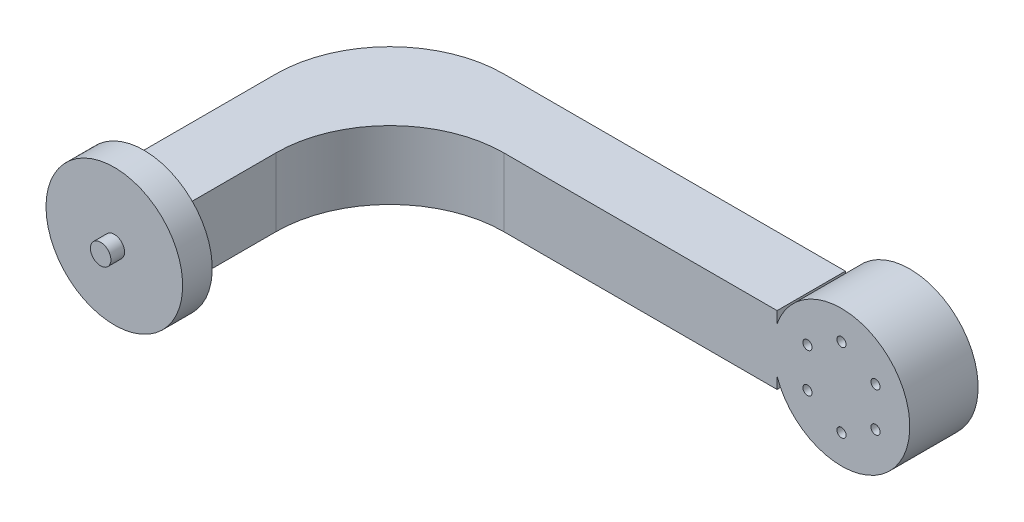
ISO-10303-21;
HEADER;
FILE_DESCRIPTION(('STEP AP214'),'2;1');
FILE_NAME('part.step','',(''),(''),'','','');
FILE_SCHEMA(('AUTOMOTIVE_DESIGN { 1 0 10303 214 1 1 1 1 }'));
ENDSEC;
DATA;
#1=APPLICATION_CONTEXT('core data for automotive mechanical design processes');
#2=APPLICATION_PROTOCOL_DEFINITION('international standard','automotive_design',2000,#1);
#3=PRODUCT_CONTEXT('',#1,'mechanical');
#4=PRODUCT('Part','Part','',(#3));
#5=PRODUCT_RELATED_PRODUCT_CATEGORY('part','',(#4));
#6=PRODUCT_DEFINITION_FORMATION('','',#4);
#7=PRODUCT_DEFINITION_CONTEXT('part definition',#1,'design');
#8=PRODUCT_DEFINITION('design','',#6,#7);
#9=PRODUCT_DEFINITION_SHAPE('','',#8);
#10=(LENGTH_UNIT() NAMED_UNIT(*) SI_UNIT(.MILLI.,.METRE.));
#11=(NAMED_UNIT(*) PLANE_ANGLE_UNIT() SI_UNIT($,.RADIAN.));
#12=(NAMED_UNIT(*) SI_UNIT($,.STERADIAN.) SOLID_ANGLE_UNIT());
#13=UNCERTAINTY_MEASURE_WITH_UNIT(LENGTH_MEASURE(1.E-05),#10,'distance_accuracy_value','');
#14=(GEOMETRIC_REPRESENTATION_CONTEXT(3) GLOBAL_UNCERTAINTY_ASSIGNED_CONTEXT((#13)) GLOBAL_UNIT_ASSIGNED_CONTEXT((#10,
#11,#12)) REPRESENTATION_CONTEXT('',''));
#15=CARTESIAN_POINT('',(0.,0.,0.));
#16=DIRECTION('',(0.,0.,1.));
#17=DIRECTION('',(1.,0.,0.));
#18=AXIS2_PLACEMENT_3D('',#15,#16,#17);
#19=CARTESIAN_POINT('',(-50.,0.,50.));
#20=DIRECTION('',(0.,-1.,0.));
#21=DIRECTION('',(0.,0.,-1.));
#22=AXIS2_PLACEMENT_3D('',#19,#20,#21);
#23=CYLINDRICAL_SURFACE('',#22,50.);
#24=DIRECTION('',(0.,-1.,0.));
#25=VECTOR('',#24,1.);
#26=CARTESIAN_POINT('',(-100.,0.,50.));
#27=LINE('',#26,#25);
#28=CARTESIAN_POINT('',(-100.,15.,50.));
#29=VERTEX_POINT('',#28);
#30=CARTESIAN_POINT('',(-100.,-15.,50.));
#31=VERTEX_POINT('',#30);
#32=EDGE_CURVE('E227',#29,#31,#27,.T.);
#33=ORIENTED_EDGE('',*,*,#32,.F.);
#34=CARTESIAN_POINT('',(-50.,15.,50.));
#35=DIRECTION('',(0.,1.,0.));
#36=DIRECTION('',(0.,0.,1.));
#37=AXIS2_PLACEMENT_3D('',#34,#35,#36);
#38=CIRCLE('',#37,50.);
#39=CARTESIAN_POINT('',(-50.,15.,0.));
#40=VERTEX_POINT('',#39);
#41=EDGE_CURVE('E61',#40,#29,#38,.T.);
#42=ORIENTED_EDGE('',*,*,#41,.F.);
#43=DIRECTION('',(0.,-1.,0.));
#44=VECTOR('',#43,1.);
#45=CARTESIAN_POINT('',(-50.,0.,0.));
#46=LINE('',#45,#44);
#47=CARTESIAN_POINT('',(-50.,-15.,0.));
#48=VERTEX_POINT('',#47);
#49=EDGE_CURVE('E230',#48,#40,#46,.F.);
#50=ORIENTED_EDGE('',*,*,#49,.F.);
#51=CARTESIAN_POINT('',(-50.,-15.,50.));
#52=DIRECTION('',(0.,1.,0.));
#53=DIRECTION('',(0.,0.,1.));
#54=AXIS2_PLACEMENT_3D('',#51,#52,#53);
#55=CIRCLE('',#54,50.);
#56=EDGE_CURVE('E48',#31,#48,#55,.F.);
#57=ORIENTED_EDGE('',*,*,#56,.F.);
#58=EDGE_LOOP('',(#33,#42,#50,#57));
#59=FACE_BOUND('',#58,.T.);
#60=ADVANCED_FACE('F45',(#59),#23,.T.);
#61=CARTESIAN_POINT('',(-20.,-112.718984849414,80.));
#62=DIRECTION('',(0.,1.,0.));
#63=DIRECTION('',(0.,0.,1.));
#64=AXIS2_PLACEMENT_3D('',#61,#62,#63);
#65=CYLINDRICAL_SURFACE('',#64,50.);
#66=DIRECTION('',(0.,1.,0.));
#67=VECTOR('',#66,1.);
#68=CARTESIAN_POINT('',(-70.,-112.718984849414,80.));
#69=LINE('',#68,#67);
#70=CARTESIAN_POINT('',(-70.,-15.,80.));
#71=VERTEX_POINT('',#70);
#72=CARTESIAN_POINT('',(-70.,15.,80.));
#73=VERTEX_POINT('',#72);
#74=EDGE_CURVE('E213',#71,#73,#69,.T.);
#75=ORIENTED_EDGE('',*,*,#74,.F.);
#76=CARTESIAN_POINT('',(-20.,-15.,80.));
#77=DIRECTION('',(0.,1.,0.));
#78=DIRECTION('',(0.,0.,1.));
#79=AXIS2_PLACEMENT_3D('',#76,#77,#78);
#80=CIRCLE('',#79,50.);
#81=CARTESIAN_POINT('',(-20.,-15.,30.));
#82=VERTEX_POINT('',#81);
#83=EDGE_CURVE('E221',#71,#82,#80,.F.);
#84=ORIENTED_EDGE('',*,*,#83,.T.);
#85=DIRECTION('',(0.,1.,0.));
#86=VECTOR('',#85,1.);
#87=CARTESIAN_POINT('',(-20.,0.,30.));
#88=LINE('',#87,#86);
#89=CARTESIAN_POINT('',(-20.,15.,30.));
#90=VERTEX_POINT('',#89);
#91=EDGE_CURVE('E217',#90,#82,#88,.F.);
#92=ORIENTED_EDGE('',*,*,#91,.F.);
#93=CARTESIAN_POINT('',(-20.,15.,80.));
#94=DIRECTION('',(0.,1.,0.));
#95=DIRECTION('',(0.,0.,1.));
#96=AXIS2_PLACEMENT_3D('',#93,#94,#95);
#97=CIRCLE('',#96,50.);
#98=EDGE_CURVE('E224',#90,#73,#97,.T.);
#99=ORIENTED_EDGE('',*,*,#98,.T.);
#100=EDGE_LOOP('',(#75,#84,#92,#99));
#101=FACE_BOUND('',#100,.T.);
#102=ADVANCED_FACE('F248',(#101),#65,.F.);
#103=CARTESIAN_POINT('',(100.,0.,30.));
#104=DIRECTION('',(1.,0.,0.));
#105=DIRECTION('',(0.,0.,-1.));
#106=AXIS2_PLACEMENT_3D('',#103,#104,#105);
#107=PLANE('',#106);
#108=DIRECTION('',(0.,-1.,0.));
#109=VECTOR('',#108,1.);
#110=CARTESIAN_POINT('',(100.,0.,0.));
#111=LINE('',#110,#109);
#112=CARTESIAN_POINT('',(100.,15.,0.));
#113=VERTEX_POINT('',#112);
#114=CARTESIAN_POINT('',(100.,9.99999999999999,0.));
#115=VERTEX_POINT('',#114);
#116=EDGE_CURVE('E185',#113,#115,#111,.T.);
#117=ORIENTED_EDGE('',*,*,#116,.F.);
#118=DIRECTION('',(0.,0.,-1.));
#119=VECTOR('',#118,1.);
#120=CARTESIAN_POINT('',(100.,15.,30.));
#121=LINE('',#120,#119);
#122=CARTESIAN_POINT('',(100.,15.,30.));
#123=VERTEX_POINT('',#122);
#124=EDGE_CURVE('E144',#123,#113,#121,.T.);
#125=ORIENTED_EDGE('',*,*,#124,.F.);
#126=DIRECTION('',(0.,-1.,0.));
#127=VECTOR('',#126,1.);
#128=CARTESIAN_POINT('',(100.,0.,30.));
#129=LINE('',#128,#127);
#130=CARTESIAN_POINT('',(100.,9.99999999999999,30.));
#131=VERTEX_POINT('',#130);
#132=EDGE_CURVE('E168',#123,#131,#129,.T.);
#133=ORIENTED_EDGE('',*,*,#132,.T.);
#134=DIRECTION('',(0.,0.,-1.));
#135=VECTOR('',#134,1.);
#136=CARTESIAN_POINT('',(100.,9.99999999999999,30.));
#137=LINE('',#136,#135);
#138=EDGE_CURVE('E184',#131,#115,#137,.T.);
#139=ORIENTED_EDGE('',*,*,#138,.T.);
#140=EDGE_LOOP('',(#117,#125,#133,#139));
#141=FACE_BOUND('',#140,.T.);
#142=ADVANCED_FACE('F256',(#141),#107,.T.);
#143=CARTESIAN_POINT('',(0.,15.,30.));
#144=DIRECTION('',(0.,1.,0.));
#145=DIRECTION('',(0.,0.,1.));
#146=AXIS2_PLACEMENT_3D('',#143,#144,#145);
#147=PLANE('',#146);
#148=DIRECTION('',(1.,0.,0.));
#149=VECTOR('',#148,1.);
#150=CARTESIAN_POINT('',(0.,15.,0.));
#151=LINE('',#150,#149);
#152=EDGE_CURVE('E189',#40,#113,#151,.T.);
#153=ORIENTED_EDGE('',*,*,#152,.F.);
#154=ORIENTED_EDGE('',*,*,#41,.T.);
#155=DIRECTION('',(0.,0.,-1.));
#156=VECTOR('',#155,1.);
#157=CARTESIAN_POINT('',(-100.,15.,30.));
#158=LINE('',#157,#156);
#159=CARTESIAN_POINT('',(-100.,15.,123.));
#160=VERTEX_POINT('',#159);
#161=EDGE_CURVE('E126',#160,#29,#158,.T.);
#162=ORIENTED_EDGE('',*,*,#161,.F.);
#163=DIRECTION('',(-1.,0.,0.));
#164=VECTOR('',#163,1.);
#165=CARTESIAN_POINT('',(0.,15.,123.));
#166=LINE('',#165,#164);
#167=CARTESIAN_POINT('',(-70.,15.,123.));
#168=VERTEX_POINT('',#167);
#169=EDGE_CURVE('E141',#168,#160,#166,.T.);
#170=ORIENTED_EDGE('',*,*,#169,.F.);
#171=DIRECTION('',(0.,0.,1.));
#172=VECTOR('',#171,1.);
#173=CARTESIAN_POINT('',(-70.,15.,0.));
#174=LINE('',#173,#172);
#175=EDGE_CURVE('E150',#73,#168,#174,.T.);
#176=ORIENTED_EDGE('',*,*,#175,.F.);
#177=ORIENTED_EDGE('',*,*,#98,.F.);
#178=DIRECTION('',(1.,0.,0.));
#179=VECTOR('',#178,1.);
#180=CARTESIAN_POINT('',(0.,15.,30.));
#181=LINE('',#180,#179);
#182=EDGE_CURVE('E172',#90,#123,#181,.T.);
#183=ORIENTED_EDGE('',*,*,#182,.T.);
#184=ORIENTED_EDGE('',*,*,#124,.T.);
#185=EDGE_LOOP('',(#153,#154,#162,#170,#176,#177,#183,#184));
#186=FACE_BOUND('',#185,.T.);
#187=ADVANCED_FACE('F139',(#186),#147,.T.);
#188=CARTESIAN_POINT('',(-100.,0.,30.));
#189=DIRECTION('',(1.,0.,0.));
#190=DIRECTION('',(0.,0.,-1.));
#191=AXIS2_PLACEMENT_3D('',#188,#189,#190);
#192=PLANE('',#191);
#193=ORIENTED_EDGE('',*,*,#161,.T.);
#194=ORIENTED_EDGE('',*,*,#32,.T.);
#195=DIRECTION('',(0.,0.,-1.));
#196=VECTOR('',#195,1.);
#197=CARTESIAN_POINT('',(-100.,-15.,30.));
#198=LINE('',#197,#196);
#199=CARTESIAN_POINT('',(-100.,-15.,123.));
#200=VERTEX_POINT('',#199);
#201=EDGE_CURVE('E127',#200,#31,#198,.T.);
#202=ORIENTED_EDGE('',*,*,#201,.F.);
#203=DIRECTION('',(0.,1.,0.));
#204=VECTOR('',#203,1.);
#205=CARTESIAN_POINT('',(-100.,-112.718984849414,123.));
#206=LINE('',#205,#204);
#207=EDGE_CURVE('E122',#200,#160,#206,.T.);
#208=ORIENTED_EDGE('',*,*,#207,.T.);
#209=EDGE_LOOP('',(#193,#194,#202,#208));
#210=FACE_BOUND('',#209,.T.);
#211=ADVANCED_FACE('F124',(#210),#192,.F.);
#212=CARTESIAN_POINT('',(0.,-15.,30.));
#213=DIRECTION('',(0.,1.,0.));
#214=DIRECTION('',(0.,0.,1.));
#215=AXIS2_PLACEMENT_3D('',#212,#213,#214);
#216=PLANE('',#215);
#217=ORIENTED_EDGE('',*,*,#201,.T.);
#218=ORIENTED_EDGE('',*,*,#56,.T.);
#219=DIRECTION('',(1.,0.,0.));
#220=VECTOR('',#219,1.);
#221=CARTESIAN_POINT('',(0.,-15.,0.));
#222=LINE('',#221,#220);
#223=CARTESIAN_POINT('',(100.,-15.,0.));
#224=VERTEX_POINT('',#223);
#225=EDGE_CURVE('E193',#48,#224,#222,.T.);
#226=ORIENTED_EDGE('',*,*,#225,.T.);
#227=DIRECTION('',(0.,0.,-1.));
#228=VECTOR('',#227,1.);
#229=CARTESIAN_POINT('',(100.,-15.,30.));
#230=LINE('',#229,#228);
#231=CARTESIAN_POINT('',(100.,-15.,30.));
#232=VERTEX_POINT('',#231);
#233=EDGE_CURVE('E204',#232,#224,#230,.T.);
#234=ORIENTED_EDGE('',*,*,#233,.F.);
#235=DIRECTION('',(1.,0.,0.));
#236=VECTOR('',#235,1.);
#237=CARTESIAN_POINT('',(0.,-15.,30.));
#238=LINE('',#237,#236);
#239=EDGE_CURVE('E177',#82,#232,#238,.T.);
#240=ORIENTED_EDGE('',*,*,#239,.F.);
#241=ORIENTED_EDGE('',*,*,#83,.F.);
#242=DIRECTION('',(0.,0.,-1.));
#243=VECTOR('',#242,1.);
#244=CARTESIAN_POINT('',(-70.,-15.,0.));
#245=LINE('',#244,#243);
#246=CARTESIAN_POINT('',(-70.,-15.,123.));
#247=VERTEX_POINT('',#246);
#248=EDGE_CURVE('E133',#247,#71,#245,.T.);
#249=ORIENTED_EDGE('',*,*,#248,.F.);
#250=DIRECTION('',(1.,0.,0.));
#251=VECTOR('',#250,1.);
#252=CARTESIAN_POINT('',(0.,-15.,123.));
#253=LINE('',#252,#251);
#254=EDGE_CURVE('E160',#200,#247,#253,.T.);
#255=ORIENTED_EDGE('',*,*,#254,.F.);
#256=EDGE_LOOP('',(#217,#218,#226,#234,#240,#241,#249,#255));
#257=FACE_BOUND('',#256,.T.);
#258=ADVANCED_FACE('F239',(#257),#216,.F.);
#259=CARTESIAN_POINT('',(100.,-10.,0.));
#260=VERTEX_POINT('',#259);
#261=EDGE_CURVE('E190',#260,#224,#111,.T.);
#262=ORIENTED_EDGE('',*,*,#261,.F.);
#263=DIRECTION('',(0.,0.,-1.));
#264=VECTOR('',#263,1.);
#265=CARTESIAN_POINT('',(100.,-10.,30.));
#266=LINE('',#265,#264);
#267=CARTESIAN_POINT('',(100.,-10.,30.));
#268=VERTEX_POINT('',#267);
#269=EDGE_CURVE('E201',#268,#260,#266,.T.);
#270=ORIENTED_EDGE('',*,*,#269,.F.);
#271=EDGE_CURVE('E174',#268,#232,#129,.T.);
#272=ORIENTED_EDGE('',*,*,#271,.T.);
#273=ORIENTED_EDGE('',*,*,#233,.T.);
#274=EDGE_LOOP('',(#262,#270,#272,#273));
#275=FACE_BOUND('',#274,.T.);
#276=ADVANCED_FACE('F269',(#275),#107,.T.);
#277=CARTESIAN_POINT('',(128.284271247462,0.,30.));
#278=DIRECTION('',(0.,0.,-1.));
#279=DIRECTION('',(-1.,0.,0.));
#280=AXIS2_PLACEMENT_3D('',#277,#278,#279);
#281=CYLINDRICAL_SURFACE('',#280,30.);
#282=CARTESIAN_POINT('',(128.284271247462,0.,0.));
#283=DIRECTION('',(0.,0.,1.));
#284=DIRECTION('',(1.,0.,0.));
#285=AXIS2_PLACEMENT_3D('',#282,#283,#284);
#286=CIRCLE('',#285,30.);
#287=EDGE_CURVE('E173',#115,#260,#286,.F.);
#288=ORIENTED_EDGE('',*,*,#287,.F.);
#289=ORIENTED_EDGE('',*,*,#138,.F.);
#290=CARTESIAN_POINT('',(128.284271247462,0.,30.));
#291=DIRECTION('',(0.,0.,1.));
#292=DIRECTION('',(1.,0.,0.));
#293=AXIS2_PLACEMENT_3D('',#290,#291,#292);
#294=CIRCLE('',#293,30.);
#295=EDGE_CURVE('E180',#131,#268,#294,.F.);
#296=ORIENTED_EDGE('',*,*,#295,.T.);
#297=ORIENTED_EDGE('',*,*,#269,.T.);
#298=EDGE_LOOP('',(#288,#289,#296,#297));
#299=FACE_BOUND('',#298,.T.);
#300=ADVANCED_FACE('F278',(#299),#281,.T.);
#301=CARTESIAN_POINT('',(0.,0.,30.));
#302=DIRECTION('',(0.,0.,1.));
#303=DIRECTION('',(1.,0.,0.));
#304=AXIS2_PLACEMENT_3D('',#301,#302,#303);
#305=PLANE('',#304);
#306=CARTESIAN_POINT('',(113.34533303218,8.62500000000016,30.));
#307=DIRECTION('',(0.,0.,1.));
#308=DIRECTION('',(0.50000000000001,0.866025403784433,0.));
#309=AXIS2_PLACEMENT_3D('',#306,#307,#308);
#310=CIRCLE('',#309,2.);
#311=CARTESIAN_POINT('',(114.34533303218,10.357050807569,30.));
#312=VERTEX_POINT('',#311);
#313=EDGE_CURVE('E338',#312,#312,#310,.T.);
#314=ORIENTED_EDGE('',*,*,#313,.F.);
#315=EDGE_LOOP('',(#314));
#316=FACE_BOUND('',#315,.T.);
#317=CARTESIAN_POINT('',(113.34533303218,-8.62499999999985,30.));
#318=DIRECTION('',(0.,0.,1.));
#319=DIRECTION('',(-0.499999999999992,0.866025403784443,0.));
#320=AXIS2_PLACEMENT_3D('',#317,#318,#319);
#321=CIRCLE('',#320,2.);
#322=CARTESIAN_POINT('',(112.34533303218,-6.89294919243097,30.));
#323=VERTEX_POINT('',#322);
#324=EDGE_CURVE('E366',#323,#323,#321,.T.);
#325=ORIENTED_EDGE('',*,*,#324,.F.);
#326=EDGE_LOOP('',(#325));
#327=FACE_BOUND('',#326,.T.);
#328=CARTESIAN_POINT('',(128.284271247462,-17.25,30.));
#329=DIRECTION('',(0.,0.,1.));
#330=DIRECTION('',(-1.,0.,0.));
#331=AXIS2_PLACEMENT_3D('',#328,#329,#330);
#332=CIRCLE('',#331,2.);
#333=CARTESIAN_POINT('',(126.284271247462,-17.25,30.));
#334=VERTEX_POINT('',#333);
#335=EDGE_CURVE('E358',#334,#334,#332,.T.);
#336=ORIENTED_EDGE('',*,*,#335,.F.);
#337=EDGE_LOOP('',(#336));
#338=FACE_BOUND('',#337,.T.);
#339=CARTESIAN_POINT('',(143.223209462743,-8.62500000000006,30.));
#340=DIRECTION('',(0.,0.,1.));
#341=DIRECTION('',(-0.500000000000004,-0.866025403784436,0.));
#342=AXIS2_PLACEMENT_3D('',#339,#340,#341);
#343=CIRCLE('',#342,2.);
#344=CARTESIAN_POINT('',(142.223209462743,-10.3570508075689,30.));
#345=VERTEX_POINT('',#344);
#346=EDGE_CURVE('E350',#345,#345,#343,.T.);
#347=ORIENTED_EDGE('',*,*,#346,.F.);
#348=EDGE_LOOP('',(#347));
#349=FACE_BOUND('',#348,.T.);
#350=CARTESIAN_POINT('',(143.223209462743,8.62499999999995,30.));
#351=DIRECTION('',(0.,0.,1.));
#352=DIRECTION('',(0.499999999999998,-0.86602540378444,0.));
#353=AXIS2_PLACEMENT_3D('',#350,#351,#352);
#354=CIRCLE('',#353,2.);
#355=CARTESIAN_POINT('',(144.223209462743,6.89294919243108,30.));
#356=VERTEX_POINT('',#355);
#357=EDGE_CURVE('E349',#356,#356,#354,.T.);
#358=ORIENTED_EDGE('',*,*,#357,.F.);
#359=EDGE_LOOP('',(#358));
#360=FACE_BOUND('',#359,.T.);
#361=CARTESIAN_POINT('',(128.284271247462,17.25,30.));
#362=DIRECTION('',(0.,0.,1.));
#363=DIRECTION('',(1.,0.,0.));
#364=AXIS2_PLACEMENT_3D('',#361,#362,#363);
#365=CIRCLE('',#364,2.);
#366=CARTESIAN_POINT('',(130.284271247462,17.25,30.));
#367=VERTEX_POINT('',#366);
#368=EDGE_CURVE('E377',#367,#367,#365,.T.);
#369=ORIENTED_EDGE('',*,*,#368,.F.);
#370=EDGE_LOOP('',(#369));
#371=FACE_BOUND('',#370,.T.);
#372=ORIENTED_EDGE('',*,*,#182,.F.);
#373=ORIENTED_EDGE('',*,*,#91,.T.);
#374=ORIENTED_EDGE('',*,*,#239,.T.);
#375=ORIENTED_EDGE('',*,*,#271,.F.);
#376=ORIENTED_EDGE('',*,*,#295,.F.);
#377=ORIENTED_EDGE('',*,*,#132,.F.);
#378=EDGE_LOOP('',(#372,#373,#374,#375,#376,#377));
#379=FACE_BOUND('',#378,.T.);
#380=ADVANCED_FACE('F251',(#316,#327,#338,#349,#360,#371,#379),#305,.T.);
#381=CARTESIAN_POINT('',(0.,0.,0.));
#382=DIRECTION('',(0.,0.,1.));
#383=DIRECTION('',(1.,0.,0.));
#384=AXIS2_PLACEMENT_3D('',#381,#382,#383);
#385=PLANE('',#384);
#386=CARTESIAN_POINT('',(113.34533303218,8.62500000000016,0.));
#387=DIRECTION('',(0.,0.,1.));
#388=DIRECTION('',(0.50000000000001,0.866025403784433,0.));
#389=AXIS2_PLACEMENT_3D('',#386,#387,#388);
#390=CIRCLE('',#389,2.);
#391=CARTESIAN_POINT('',(114.34533303218,10.357050807569,0.));
#392=VERTEX_POINT('',#391);
#393=EDGE_CURVE('E342',#392,#392,#390,.T.);
#394=ORIENTED_EDGE('',*,*,#393,.T.);
#395=EDGE_LOOP('',(#394));
#396=FACE_BOUND('',#395,.T.);
#397=CARTESIAN_POINT('',(113.34533303218,-8.62499999999985,0.));
#398=DIRECTION('',(0.,0.,1.));
#399=DIRECTION('',(-0.499999999999992,0.866025403784443,0.));
#400=AXIS2_PLACEMENT_3D('',#397,#398,#399);
#401=CIRCLE('',#400,2.);
#402=CARTESIAN_POINT('',(112.34533303218,-6.89294919243097,0.));
#403=VERTEX_POINT('',#402);
#404=EDGE_CURVE('E362',#403,#403,#401,.T.);
#405=ORIENTED_EDGE('',*,*,#404,.T.);
#406=EDGE_LOOP('',(#405));
#407=FACE_BOUND('',#406,.T.);
#408=CARTESIAN_POINT('',(128.284271247462,-17.25,0.));
#409=DIRECTION('',(0.,0.,1.));
#410=DIRECTION('',(-1.,0.,0.));
#411=AXIS2_PLACEMENT_3D('',#408,#409,#410);
#412=CIRCLE('',#411,2.);
#413=CARTESIAN_POINT('',(126.284271247462,-17.25,0.));
#414=VERTEX_POINT('',#413);
#415=EDGE_CURVE('E354',#414,#414,#412,.T.);
#416=ORIENTED_EDGE('',*,*,#415,.T.);
#417=EDGE_LOOP('',(#416));
#418=FACE_BOUND('',#417,.T.);
#419=CARTESIAN_POINT('',(143.223209462743,-8.62500000000006,0.));
#420=DIRECTION('',(0.,0.,1.));
#421=DIRECTION('',(-0.500000000000004,-0.866025403784436,0.));
#422=AXIS2_PLACEMENT_3D('',#419,#420,#421);
#423=CIRCLE('',#422,2.);
#424=CARTESIAN_POINT('',(142.223209462743,-10.3570508075689,0.));
#425=VERTEX_POINT('',#424);
#426=EDGE_CURVE('E345',#425,#425,#423,.T.);
#427=ORIENTED_EDGE('',*,*,#426,.T.);
#428=EDGE_LOOP('',(#427));
#429=FACE_BOUND('',#428,.T.);
#430=CARTESIAN_POINT('',(143.223209462743,8.62499999999995,0.));
#431=DIRECTION('',(0.,0.,1.));
#432=DIRECTION('',(0.499999999999998,-0.86602540378444,0.));
#433=AXIS2_PLACEMENT_3D('',#430,#431,#432);
#434=CIRCLE('',#433,2.);
#435=CARTESIAN_POINT('',(144.223209462743,6.89294919243108,0.));
#436=VERTEX_POINT('',#435);
#437=EDGE_CURVE('E373',#436,#436,#434,.T.);
#438=ORIENTED_EDGE('',*,*,#437,.T.);
#439=EDGE_LOOP('',(#438));
#440=FACE_BOUND('',#439,.T.);
#441=CARTESIAN_POINT('',(128.284271247462,17.25,0.));
#442=DIRECTION('',(0.,0.,1.));
#443=DIRECTION('',(1.,0.,0.));
#444=AXIS2_PLACEMENT_3D('',#441,#442,#443);
#445=CIRCLE('',#444,2.);
#446=CARTESIAN_POINT('',(130.284271247462,17.25,0.));
#447=VERTEX_POINT('',#446);
#448=EDGE_CURVE('E381',#447,#447,#445,.T.);
#449=ORIENTED_EDGE('',*,*,#448,.T.);
#450=EDGE_LOOP('',(#449));
#451=FACE_BOUND('',#450,.T.);
#452=ORIENTED_EDGE('',*,*,#225,.F.);
#453=ORIENTED_EDGE('',*,*,#49,.T.);
#454=ORIENTED_EDGE('',*,*,#152,.T.);
#455=ORIENTED_EDGE('',*,*,#116,.T.);
#456=ORIENTED_EDGE('',*,*,#287,.T.);
#457=ORIENTED_EDGE('',*,*,#261,.T.);
#458=EDGE_LOOP('',(#452,#453,#454,#455,#456,#457));
#459=FACE_BOUND('',#458,.T.);
#460=ADVANCED_FACE('F259',(#396,#407,#418,#429,#440,#451,#459),#385,.F.);
#461=CARTESIAN_POINT('',(-70.,-112.718984849414,0.));
#462=DIRECTION('',(-1.,0.,0.));
#463=DIRECTION('',(0.,0.,1.));
#464=AXIS2_PLACEMENT_3D('',#461,#462,#463);
#465=PLANE('',#464);
#466=ORIENTED_EDGE('',*,*,#248,.T.);
#467=ORIENTED_EDGE('',*,*,#74,.T.);
#468=ORIENTED_EDGE('',*,*,#175,.T.);
#469=DIRECTION('',(0.,1.,0.));
#470=VECTOR('',#469,1.);
#471=CARTESIAN_POINT('',(-70.,-112.718984849414,123.));
#472=LINE('',#471,#470);
#473=EDGE_CURVE('E134',#247,#168,#472,.T.);
#474=ORIENTED_EDGE('',*,*,#473,.F.);
#475=EDGE_LOOP('',(#466,#467,#468,#474));
#476=FACE_BOUND('',#475,.T.);
#477=ADVANCED_FACE('F243',(#476),#465,.F.);
#478=CARTESIAN_POINT('',(-85.,0.,136.));
#479=DIRECTION('',(0.,0.,-1.));
#480=DIRECTION('',(-1.,0.,0.));
#481=AXIS2_PLACEMENT_3D('',#478,#479,#480);
#482=CYLINDRICAL_SURFACE('',#481,30.);
#483=CARTESIAN_POINT('',(-85.,0.,136.));
#484=DIRECTION('',(0.,0.,1.));
#485=DIRECTION('',(1.,0.,0.));
#486=AXIS2_PLACEMENT_3D('',#483,#484,#485);
#487=CIRCLE('',#486,30.);
#488=CARTESIAN_POINT('',(-115.,0.,136.));
#489=VERTEX_POINT('',#488);
#490=EDGE_CURVE('E151',#489,#489,#487,.T.);
#491=CARTESIAN_POINT('',(-85.,0.,123.));
#492=DIRECTION('',(0.,0.,1.));
#493=DIRECTION('',(1.,0.,0.));
#494=AXIS2_PLACEMENT_3D('',#491,#492,#493);
#495=CIRCLE('',#494,30.);
#496=CARTESIAN_POINT('',(-115.,0.,123.));
#497=VERTEX_POINT('',#496);
#498=EDGE_CURVE('E157',#497,#497,#495,.T.);
#499=CARTESIAN_POINT('',(-115.,0.,136.));
#500=CARTESIAN_POINT('',(-115.,0.,135.864583333333));
#501=CARTESIAN_POINT('',(-115.,0.,135.729166666667));
#502=CARTESIAN_POINT('',(-115.,0.,135.458333333333));
#503=CARTESIAN_POINT('',(-115.,0.,135.322916666667));
#504=CARTESIAN_POINT('',(-115.,0.,135.052083333333));
#505=CARTESIAN_POINT('',(-115.,0.,134.916666666667));
#506=CARTESIAN_POINT('',(-115.,0.,134.645833333333));
#507=CARTESIAN_POINT('',(-115.,0.,134.510416666667));
#508=CARTESIAN_POINT('',(-115.,0.,134.239583333333));
#509=CARTESIAN_POINT('',(-115.,0.,134.104166666667));
#510=CARTESIAN_POINT('',(-115.,0.,133.833333333333));
#511=CARTESIAN_POINT('',(-115.,0.,133.697916666667));
#512=CARTESIAN_POINT('',(-115.,0.,133.427083333333));
#513=CARTESIAN_POINT('',(-115.,0.,133.291666666667));
#514=CARTESIAN_POINT('',(-115.,0.,133.020833333333));
#515=CARTESIAN_POINT('',(-115.,0.,132.885416666667));
#516=CARTESIAN_POINT('',(-115.,0.,132.614583333333));
#517=CARTESIAN_POINT('',(-115.,0.,132.479166666667));
#518=CARTESIAN_POINT('',(-115.,0.,132.208333333333));
#519=CARTESIAN_POINT('',(-115.,0.,132.072916666667));
#520=CARTESIAN_POINT('',(-115.,0.,131.802083333333));
#521=CARTESIAN_POINT('',(-115.,0.,131.666666666667));
#522=CARTESIAN_POINT('',(-115.,0.,131.395833333333));
#523=CARTESIAN_POINT('',(-115.,0.,131.260416666667));
#524=CARTESIAN_POINT('',(-115.,0.,130.989583333333));
#525=CARTESIAN_POINT('',(-115.,0.,130.854166666667));
#526=CARTESIAN_POINT('',(-115.,0.,130.583333333333));
#527=CARTESIAN_POINT('',(-115.,0.,130.447916666667));
#528=CARTESIAN_POINT('',(-115.,0.,130.177083333333));
#529=CARTESIAN_POINT('',(-115.,0.,130.041666666667));
#530=CARTESIAN_POINT('',(-115.,0.,129.770833333333));
#531=CARTESIAN_POINT('',(-115.,0.,129.635416666667));
#532=CARTESIAN_POINT('',(-115.,0.,129.364583333333));
#533=CARTESIAN_POINT('',(-115.,0.,129.229166666667));
#534=CARTESIAN_POINT('',(-115.,0.,128.958333333333));
#535=CARTESIAN_POINT('',(-115.,0.,128.822916666667));
#536=CARTESIAN_POINT('',(-115.,0.,128.552083333333));
#537=CARTESIAN_POINT('',(-115.,0.,128.416666666667));
#538=CARTESIAN_POINT('',(-115.,0.,128.145833333333));
#539=CARTESIAN_POINT('',(-115.,0.,128.010416666667));
#540=CARTESIAN_POINT('',(-115.,0.,127.739583333333));
#541=CARTESIAN_POINT('',(-115.,0.,127.604166666667));
#542=CARTESIAN_POINT('',(-115.,0.,127.333333333333));
#543=CARTESIAN_POINT('',(-115.,0.,127.197916666667));
#544=CARTESIAN_POINT('',(-115.,0.,126.927083333333));
#545=CARTESIAN_POINT('',(-115.,0.,126.791666666667));
#546=CARTESIAN_POINT('',(-115.,0.,126.520833333333));
#547=CARTESIAN_POINT('',(-115.,0.,126.385416666667));
#548=CARTESIAN_POINT('',(-115.,0.,126.114583333333));
#549=CARTESIAN_POINT('',(-115.,0.,125.979166666667));
#550=CARTESIAN_POINT('',(-115.,0.,125.708333333333));
#551=CARTESIAN_POINT('',(-115.,0.,125.572916666667));
#552=CARTESIAN_POINT('',(-115.,0.,125.302083333333));
#553=CARTESIAN_POINT('',(-115.,0.,125.166666666667));
#554=CARTESIAN_POINT('',(-115.,0.,124.895833333333));
#555=CARTESIAN_POINT('',(-115.,0.,124.760416666667));
#556=CARTESIAN_POINT('',(-115.,0.,124.489583333333));
#557=CARTESIAN_POINT('',(-115.,0.,124.354166666667));
#558=CARTESIAN_POINT('',(-115.,0.,124.083333333333));
#559=CARTESIAN_POINT('',(-115.,0.,123.947916666667));
#560=CARTESIAN_POINT('',(-115.,0.,123.677083333333));
#561=CARTESIAN_POINT('',(-115.,0.,123.541666666667));
#562=CARTESIAN_POINT('',(-115.,0.,123.270833333333));
#563=CARTESIAN_POINT('',(-115.,0.,123.135416666667));
#564=CARTESIAN_POINT('',(-115.,0.,123.));
#565=B_SPLINE_CURVE_WITH_KNOTS('',3,(#499,#500,#501,#502,#503,#504,#505,#506,#507,#508,#509,
#510,#511,#512,#513,#514,#515,#516,#517,#518,#519,#520,#521,#522,#523,#524,#525,#526,#527,#528,
#529,#530,#531,#532,#533,#534,#535,#536,#537,#538,#539,#540,#541,#542,#543,#544,#545,#546,#547,
#548,#549,#550,#551,#552,#553,#554,#555,#556,#557,#558,#559,#560,#561,#562,#563,#564),
.UNSPECIFIED.,.F.,.F.,(4,2,2,2,2,2,2,2,2,2,2,2,2,2,2,2,2,2,2,2,2,2,2,2,2,2,2,2,2,2,2,2,4),(0.,
0.406249999999997,0.812499999999994,1.21874999999999,1.62499999999999,2.03124999999998,
2.43749999999998,2.84374999999998,3.24999999999998,3.65624999999997,4.06249999999997,
4.46874999999999,4.87499999999999,5.28124999999999,5.68749999999998,6.09374999999998,
6.49999999999998,6.90624999999998,7.31249999999997,7.71874999999997,8.12499999999997,
8.53124999999999,8.93749999999999,9.34374999999998,9.74999999999998,10.15625,10.5625,10.96875,
11.375,11.78125,12.1875,12.59375,13.),.UNSPECIFIED.);
#566=EDGE_CURVE('BSEAM291',#489,#497,#565,.T.);
#567=ORIENTED_EDGE('',*,*,#490,.F.);
#568=ORIENTED_EDGE('',*,*,#498,.T.);
#569=ORIENTED_EDGE('',*,*,#566,.T.);
#570=ORIENTED_EDGE('',*,*,#566,.F.);
#571=EDGE_LOOP('',(#567,#569,#568,#570));
#572=FACE_BOUND('',#571,.T.);
#573=ADVANCED_FACE('F291',(#572),#482,.T.);
#574=CARTESIAN_POINT('',(-85.,0.,136.));
#575=DIRECTION('',(0.,0.,1.));
#576=DIRECTION('',(1.,0.,0.));
#577=AXIS2_PLACEMENT_3D('',#574,#575,#576);
#578=PLANE('',#577);
#579=CARTESIAN_POINT('',(-85.,0.,136.));
#580=DIRECTION('',(0.,0.,1.));
#581=DIRECTION('',(1.,0.,0.));
#582=AXIS2_PLACEMENT_3D('',#579,#580,#581);
#583=CIRCLE('',#582,4.5);
#584=CARTESIAN_POINT('',(-80.5,0.,136.));
#585=VERTEX_POINT('',#584);
#586=EDGE_CURVE('E11',#585,#585,#583,.T.);
#587=ORIENTED_EDGE('',*,*,#586,.F.);
#588=EDGE_LOOP('',(#587));
#589=FACE_BOUND('',#588,.T.);
#590=ORIENTED_EDGE('',*,*,#490,.T.);
#591=EDGE_LOOP('',(#590));
#592=FACE_BOUND('',#591,.T.);
#593=ADVANCED_FACE('F294',(#589,#592),#578,.T.);
#594=CARTESIAN_POINT('',(-85.,0.,123.));
#595=DIRECTION('',(0.,0.,1.));
#596=DIRECTION('',(1.,0.,0.));
#597=AXIS2_PLACEMENT_3D('',#594,#595,#596);
#598=PLANE('',#597);
#599=ORIENTED_EDGE('',*,*,#207,.F.);
#600=ORIENTED_EDGE('',*,*,#254,.T.);
#601=ORIENTED_EDGE('',*,*,#473,.T.);
#602=ORIENTED_EDGE('',*,*,#169,.T.);
#603=EDGE_LOOP('',(#599,#600,#601,#602));
#604=FACE_BOUND('',#603,.T.);
#605=ORIENTED_EDGE('',*,*,#498,.F.);
#606=EDGE_LOOP('',(#605));
#607=FACE_BOUND('',#606,.T.);
#608=ADVANCED_FACE('F146',(#604,#607),#598,.F.);
#609=CARTESIAN_POINT('',(128.284271247462,17.25,0.));
#610=DIRECTION('',(0.,0.,1.));
#611=DIRECTION('',(1.,0.,0.));
#612=AXIS2_PLACEMENT_3D('',#609,#610,#611);
#613=CYLINDRICAL_SURFACE('',#612,2.);
#614=ORIENTED_EDGE('',*,*,#448,.F.);
#615=EDGE_LOOP('',(#614));
#616=FACE_BOUND('',#615,.T.);
#617=ORIENTED_EDGE('',*,*,#368,.T.);
#618=EDGE_LOOP('',(#617));
#619=FACE_BOUND('',#618,.T.);
#620=ADVANCED_FACE('F298',(#616,#619),#613,.F.);
#621=CARTESIAN_POINT('',(143.223209462743,8.62499999999995,0.));
#622=DIRECTION('',(0.,0.,1.));
#623=DIRECTION('',(1.,0.,0.));
#624=AXIS2_PLACEMENT_3D('',#621,#622,#623);
#625=CYLINDRICAL_SURFACE('',#624,2.);
#626=ORIENTED_EDGE('',*,*,#437,.F.);
#627=EDGE_LOOP('',(#626));
#628=FACE_BOUND('',#627,.T.);
#629=ORIENTED_EDGE('',*,*,#357,.T.);
#630=EDGE_LOOP('',(#629));
#631=FACE_BOUND('',#630,.T.);
#632=ADVANCED_FACE('F304',(#628,#631),#625,.F.);
#633=CARTESIAN_POINT('',(143.223209462743,-8.62500000000006,0.));
#634=DIRECTION('',(0.,0.,1.));
#635=DIRECTION('',(1.,0.,0.));
#636=AXIS2_PLACEMENT_3D('',#633,#634,#635);
#637=CYLINDRICAL_SURFACE('',#636,2.);
#638=ORIENTED_EDGE('',*,*,#426,.F.);
#639=EDGE_LOOP('',(#638));
#640=FACE_BOUND('',#639,.T.);
#641=ORIENTED_EDGE('',*,*,#346,.T.);
#642=EDGE_LOOP('',(#641));
#643=FACE_BOUND('',#642,.T.);
#644=ADVANCED_FACE('F308',(#640,#643),#637,.F.);
#645=CARTESIAN_POINT('',(128.284271247462,-17.25,0.));
#646=DIRECTION('',(0.,0.,1.));
#647=DIRECTION('',(1.,0.,0.));
#648=AXIS2_PLACEMENT_3D('',#645,#646,#647);
#649=CYLINDRICAL_SURFACE('',#648,2.);
#650=ORIENTED_EDGE('',*,*,#415,.F.);
#651=EDGE_LOOP('',(#650));
#652=FACE_BOUND('',#651,.T.);
#653=ORIENTED_EDGE('',*,*,#335,.T.);
#654=EDGE_LOOP('',(#653));
#655=FACE_BOUND('',#654,.T.);
#656=ADVANCED_FACE('F318',(#652,#655),#649,.F.);
#657=CARTESIAN_POINT('',(113.34533303218,-8.62499999999985,0.));
#658=DIRECTION('',(0.,0.,1.));
#659=DIRECTION('',(1.,0.,0.));
#660=AXIS2_PLACEMENT_3D('',#657,#658,#659);
#661=CYLINDRICAL_SURFACE('',#660,2.);
#662=ORIENTED_EDGE('',*,*,#404,.F.);
#663=EDGE_LOOP('',(#662));
#664=FACE_BOUND('',#663,.T.);
#665=ORIENTED_EDGE('',*,*,#324,.T.);
#666=EDGE_LOOP('',(#665));
#667=FACE_BOUND('',#666,.T.);
#668=ADVANCED_FACE('F314',(#664,#667),#661,.F.);
#669=CARTESIAN_POINT('',(113.34533303218,8.62500000000016,0.));
#670=DIRECTION('',(0.,0.,1.));
#671=DIRECTION('',(1.,0.,0.));
#672=AXIS2_PLACEMENT_3D('',#669,#670,#671);
#673=CYLINDRICAL_SURFACE('',#672,2.);
#674=ORIENTED_EDGE('',*,*,#393,.F.);
#675=EDGE_LOOP('',(#674));
#676=FACE_BOUND('',#675,.T.);
#677=ORIENTED_EDGE('',*,*,#313,.T.);
#678=EDGE_LOOP('',(#677));
#679=FACE_BOUND('',#678,.T.);
#680=ADVANCED_FACE('F310',(#676,#679),#673,.F.);
#681=CARTESIAN_POINT('',(-85.,0.,142.));
#682=DIRECTION('',(0.,0.,-1.));
#683=DIRECTION('',(-1.,0.,0.));
#684=AXIS2_PLACEMENT_3D('',#681,#682,#683);
#685=CYLINDRICAL_SURFACE('',#684,4.5);
#686=CARTESIAN_POINT('',(-85.,0.,142.));
#687=DIRECTION('',(0.,0.,1.));
#688=DIRECTION('',(1.,0.,0.));
#689=AXIS2_PLACEMENT_3D('',#686,#687,#688);
#690=CIRCLE('',#689,4.5);
#691=CARTESIAN_POINT('',(-80.5,0.,142.));
#692=VERTEX_POINT('',#691);
#693=EDGE_CURVE('E336',#692,#692,#690,.T.);
#694=ORIENTED_EDGE('',*,*,#693,.F.);
#695=EDGE_LOOP('',(#694));
#696=FACE_BOUND('',#695,.T.);
#697=ORIENTED_EDGE('',*,*,#586,.T.);
#698=EDGE_LOOP('',(#697));
#699=FACE_BOUND('',#698,.T.);
#700=ADVANCED_FACE('F313',(#696,#699),#685,.T.);
#701=CARTESIAN_POINT('',(-85.,0.,142.));
#702=DIRECTION('',(0.,0.,1.));
#703=DIRECTION('',(1.,0.,0.));
#704=AXIS2_PLACEMENT_3D('',#701,#702,#703);
#705=PLANE('',#704);
#706=ORIENTED_EDGE('',*,*,#693,.T.);
#707=EDGE_LOOP('',(#706));
#708=FACE_BOUND('',#707,.T.);
#709=ADVANCED_FACE('F328',(#708),#705,.T.);
#710=CLOSED_SHELL('',(#60,#102,#142,#187,#211,#258,#276,#300,#380,#460,#477,#573,#593,#608,#620,
#632,#644,#656,#668,#680,#700,#709));
#711=MANIFOLD_SOLID_BREP('B2',#710);
#712=ADVANCED_BREP_SHAPE_REPRESENTATION('',(#18,#711),#14);
#713=SHAPE_DEFINITION_REPRESENTATION(#9,#712);
ENDSEC;
END-ISO-10303-21;
